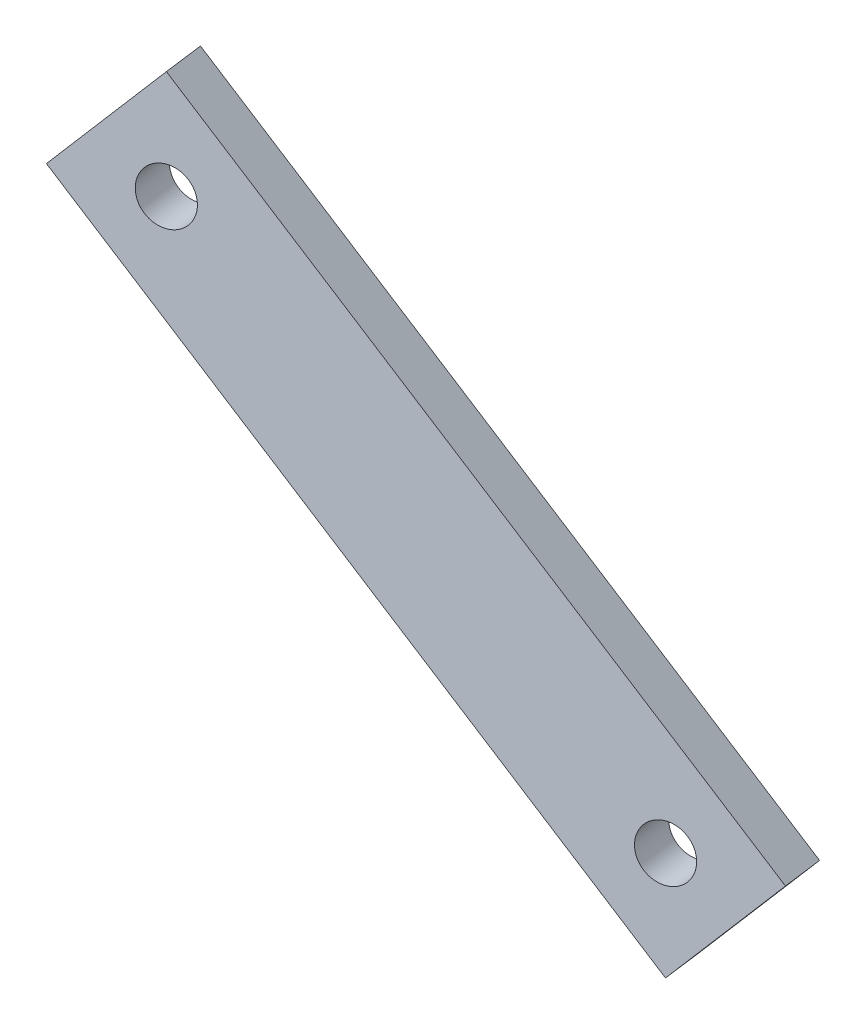
ISO-10303-21;
HEADER;
FILE_DESCRIPTION(('STEP AP214'),'2;1');
FILE_NAME('part.step','',(''),(''),'','','');
FILE_SCHEMA(('AUTOMOTIVE_DESIGN { 1 0 10303 214 1 1 1 1 }'));
ENDSEC;
DATA;
#1=APPLICATION_CONTEXT('core data for automotive mechanical design processes');
#2=APPLICATION_PROTOCOL_DEFINITION('international standard','automotive_design',2000,#1);
#3=PRODUCT_CONTEXT('',#1,'mechanical');
#4=PRODUCT('Part','Part','',(#3));
#5=PRODUCT_RELATED_PRODUCT_CATEGORY('part','',(#4));
#6=PRODUCT_DEFINITION_FORMATION('','',#4);
#7=PRODUCT_DEFINITION_CONTEXT('part definition',#1,'design');
#8=PRODUCT_DEFINITION('design','',#6,#7);
#9=PRODUCT_DEFINITION_SHAPE('','',#8);
#10=(LENGTH_UNIT() NAMED_UNIT(*) SI_UNIT(.MILLI.,.METRE.));
#11=(NAMED_UNIT(*) PLANE_ANGLE_UNIT() SI_UNIT($,.RADIAN.));
#12=(NAMED_UNIT(*) SI_UNIT($,.STERADIAN.) SOLID_ANGLE_UNIT());
#13=UNCERTAINTY_MEASURE_WITH_UNIT(LENGTH_MEASURE(1.E-05),#10,'distance_accuracy_value','');
#14=(GEOMETRIC_REPRESENTATION_CONTEXT(3) GLOBAL_UNCERTAINTY_ASSIGNED_CONTEXT((#13)) GLOBAL_UNIT_ASSIGNED_CONTEXT((#10,
#11,#12)) REPRESENTATION_CONTEXT('',''));
#15=CARTESIAN_POINT('',(0.,0.,0.));
#16=DIRECTION('',(0.,0.,1.));
#17=DIRECTION('',(1.,0.,0.));
#18=AXIS2_PLACEMENT_3D('',#15,#16,#17);
#19=CARTESIAN_POINT('',(38.6285026922329,20.4555824476356,159.237957676174));
#20=DIRECTION('',(-0.233930394424774,-0.123876985558802,-0.964329333274237));
#21=DIRECTION('',(-0.97181465537802,0.,0.235746210133905));
#22=AXIS2_PLACEMENT_3D('',#19,#20,#21);
#23=PLANE('',#22);
#24=DIRECTION('',(0.755645660035762,-0.647277315176013,-0.100158443117139));
#25=VECTOR('',#24,1.);
#26=CARTESIAN_POINT('',(-16.5231212716797,-89.9630264987664,186.801119612432));
#27=LINE('',#26,#25);
#28=CARTESIAN_POINT('',(-39.9482141109045,-69.8973634471136,189.906041605288));
#29=VERTEX_POINT('',#28);
#30=CARTESIAN_POINT('',(-16.5231212716797,-89.9630264987664,186.801119612432));
#31=VERTEX_POINT('',#30);
#32=EDGE_CURVE('E54',#29,#31,#27,.T.);
#33=ORIENTED_EDGE('',*,*,#32,.T.);
#34=DIRECTION('',(0.611781175775585,0.752121379637243,-0.245024944157147));
#35=VECTOR('',#34,1.);
#36=CARTESIAN_POINT('',(-12.8524342170262,-85.4502982209429,185.330969947489));
#37=LINE('',#36,#35);
#38=CARTESIAN_POINT('',(-12.8524342170262,-85.4502982209429,185.330969947489));
#39=VERTEX_POINT('',#38);
#40=EDGE_CURVE('E85',#31,#39,#37,.T.);
#41=ORIENTED_EDGE('',*,*,#40,.T.);
#42=DIRECTION('',(-0.755645660035763,0.647277315176013,0.100158443117137));
#43=VECTOR('',#42,1.);
#44=CARTESIAN_POINT('',(-25.4341138726848,-74.6729772375418,186.998631806422));
#45=LINE('',#44,#43);
#46=CARTESIAN_POINT('',(-36.277527056251,-65.3846351692901,188.435891940345));
#47=VERTEX_POINT('',#46);
#48=EDGE_CURVE('E89',#39,#47,#45,.T.);
#49=ORIENTED_EDGE('',*,*,#48,.T.);
#50=DIRECTION('',(-0.611781175775583,-0.752121379637243,0.245024944157152));
#51=VECTOR('',#50,1.);
#52=CARTESIAN_POINT('',(-39.9482141109045,-69.8973634471136,189.906041605288));
#53=LINE('',#52,#51);
#54=EDGE_CURVE('E96',#47,#29,#53,.T.);
#55=ORIENTED_EDGE('',*,*,#54,.T.);
#56=EDGE_LOOP('',(#33,#41,#49,#55));
#57=FACE_BOUND('',#56,.T.);
#58=CARTESIAN_POINT('',(-16.954585245294,-85.7646712331469,186.366468251513));
#59=DIRECTION('',(0.233930394424774,0.123876985558802,0.964329333274237));
#60=DIRECTION('',(0.971814655378021,0.,-0.235746210133904));
#61=AXIS2_PLACEMENT_3D('',#58,#59,#60);
#62=CIRCLE('',#61,1.10000033999937);
#63=CARTESIAN_POINT('',(-15.8855887939618,-85.7646712331469,186.107147340212));
#64=VERTEX_POINT('',#63);
#65=EDGE_CURVE('E103',#64,#64,#62,.T.);
#66=ORIENTED_EDGE('',*,*,#65,.F.);
#67=EDGE_LOOP('',(#66));
#68=FACE_BOUND('',#67,.T.);
#69=CARTESIAN_POINT('',(-35.8458041243041,-69.5826720725501,188.870439585666));
#70=DIRECTION('',(0.233930394424774,0.123876985558802,0.964329333274237));
#71=DIRECTION('',(0.971814655378021,0.,-0.235746210133904));
#72=AXIS2_PLACEMENT_3D('',#69,#70,#71);
#73=CIRCLE('',#72,1.1000003399993);
#74=CARTESIAN_POINT('',(-34.776807672972,-69.5826720725501,188.611118674365));
#75=VERTEX_POINT('',#74);
#76=EDGE_CURVE('E141',#75,#75,#73,.T.);
#77=ORIENTED_EDGE('',*,*,#76,.F.);
#78=EDGE_LOOP('',(#77));
#79=FACE_BOUND('',#78,.T.);
#80=ADVANCED_FACE('F37',(#57,#68,#79),#23,.F.);
#81=CARTESIAN_POINT('',(38.1606419033834,20.207828476518,157.309299009626));
#82=DIRECTION('',(-0.233930394424774,-0.123876985558802,-0.964329333274237));
#83=DIRECTION('',(-0.97181465537802,0.,0.235746210133905));
#84=AXIS2_PLACEMENT_3D('',#81,#82,#83);
#85=PLANE('',#84);
#86=CARTESIAN_POINT('',(-17.4224460341436,-86.0124252042645,184.437809584964));
#87=DIRECTION('',(0.233930394424774,0.123876985558802,0.964329333274237));
#88=DIRECTION('',(0.971814655378021,0.,-0.235746210133904));
#89=AXIS2_PLACEMENT_3D('',#86,#87,#88);
#90=CIRCLE('',#89,1.10000033999937);
#91=CARTESIAN_POINT('',(-16.3534495828114,-86.0124252042645,184.178488673664));
#92=VERTEX_POINT('',#91);
#93=EDGE_CURVE('E146',#92,#92,#90,.T.);
#94=ORIENTED_EDGE('',*,*,#93,.T.);
#95=EDGE_LOOP('',(#94));
#96=FACE_BOUND('',#95,.T.);
#97=DIRECTION('',(0.611781175775585,0.752121379637243,-0.245024944157147));
#98=VECTOR('',#97,1.);
#99=CARTESIAN_POINT('',(-13.3202950058757,-85.6980521920605,183.402311280941));
#100=LINE('',#99,#98);
#101=CARTESIAN_POINT('',(-16.9909820605293,-90.210780469884,184.872460945884));
#102=VERTEX_POINT('',#101);
#103=CARTESIAN_POINT('',(-13.3202950058757,-85.6980521920605,183.402311280941));
#104=VERTEX_POINT('',#103);
#105=EDGE_CURVE('E92',#102,#104,#100,.T.);
#106=ORIENTED_EDGE('',*,*,#105,.F.);
#107=DIRECTION('',(0.755645660035781,-0.64727731517599,-0.100158443117145));
#108=VECTOR('',#107,1.);
#109=CARTESIAN_POINT('',(-29.5726617161879,-79.4334594864829,186.540122804816));
#110=LINE('',#109,#108);
#111=CARTESIAN_POINT('',(-40.416074899754,-70.1451174182312,187.97738293874));
#112=VERTEX_POINT('',#111);
#113=EDGE_CURVE('E78',#112,#102,#110,.T.);
#114=ORIENTED_EDGE('',*,*,#113,.F.);
#115=DIRECTION('',(-0.611781175775583,-0.752121379637243,0.245024944157152));
#116=VECTOR('',#115,1.);
#117=CARTESIAN_POINT('',(-40.416074899754,-70.1451174182312,187.97738293874));
#118=LINE('',#117,#116);
#119=CARTESIAN_POINT('',(-36.7453878451006,-65.6323891404078,186.507233273797));
#120=VERTEX_POINT('',#119);
#121=EDGE_CURVE('E105',#120,#112,#118,.T.);
#122=ORIENTED_EDGE('',*,*,#121,.F.);
#123=DIRECTION('',(-0.755645660035931,0.647277315175804,0.100158443117217));
#124=VECTOR('',#123,1.);
#125=CARTESIAN_POINT('',(-36.7453878451006,-65.6323891404078,186.507233273797));
#126=LINE('',#125,#124);
#127=EDGE_CURVE('E71',#104,#120,#126,.T.);
#128=ORIENTED_EDGE('',*,*,#127,.F.);
#129=EDGE_LOOP('',(#106,#114,#122,#128));
#130=FACE_BOUND('',#129,.T.);
#131=CARTESIAN_POINT('',(-36.3136649131537,-69.8304260436677,186.941780919118));
#132=DIRECTION('',(0.233930394424774,0.123876985558802,0.964329333274237));
#133=DIRECTION('',(0.971814655378021,0.,-0.235746210133904));
#134=AXIS2_PLACEMENT_3D('',#131,#132,#133);
#135=CIRCLE('',#134,1.1000003399993);
#136=CARTESIAN_POINT('',(-35.2446684618216,-69.8304260436677,186.682460007817));
#137=VERTEX_POINT('',#136);
#138=EDGE_CURVE('E144',#137,#137,#135,.T.);
#139=ORIENTED_EDGE('',*,*,#138,.T.);
#140=EDGE_LOOP('',(#139));
#141=FACE_BOUND('',#140,.T.);
#142=ADVANCED_FACE('F112',(#96,#130,#141),#85,.T.);
#143=CARTESIAN_POINT('',(-12.8524342170262,-85.4502982209429,185.330969947489));
#144=DIRECTION('',(-0.755645660035782,0.647277315175989,0.100158443117146));
#145=DIRECTION('',(-0.650548598653905,-0.759464627740779,0.));
#146=AXIS2_PLACEMENT_3D('',#143,#144,#145);
#147=PLANE('',#146);
#148=ORIENTED_EDGE('',*,*,#105,.T.);
#149=DIRECTION('',(-0.233930394424774,-0.123876985558802,-0.964329333274237));
#150=VECTOR('',#149,1.);
#151=CARTESIAN_POINT('',(-12.8524342170262,-85.4502982209429,185.330969947489));
#152=LINE('',#151,#150);
#153=EDGE_CURVE('E46',#39,#104,#152,.T.);
#154=ORIENTED_EDGE('',*,*,#153,.F.);
#155=ORIENTED_EDGE('',*,*,#40,.F.);
#156=DIRECTION('',(-0.233930394424774,-0.123876985558802,-0.964329333274237));
#157=VECTOR('',#156,1.);
#158=CARTESIAN_POINT('',(-16.5231212716797,-89.9630264987664,186.801119612432));
#159=LINE('',#158,#157);
#160=EDGE_CURVE('E11',#31,#102,#159,.T.);
#161=ORIENTED_EDGE('',*,*,#160,.T.);
#162=EDGE_LOOP('',(#148,#154,#155,#161));
#163=FACE_BOUND('',#162,.T.);
#164=ADVANCED_FACE('F39',(#163),#147,.F.);
#165=CARTESIAN_POINT('',(-36.277527056251,-65.3846351692901,188.435891940345));
#166=DIRECTION('',(-0.611781175775398,-0.752121379637402,0.245024944157127));
#167=DIRECTION('',(0.77576933080262,-0.631016596759589,0.));
#168=AXIS2_PLACEMENT_3D('',#165,#166,#167);
#169=PLANE('',#168);
#170=ORIENTED_EDGE('',*,*,#127,.T.);
#171=DIRECTION('',(-0.233930394424774,-0.123876985558802,-0.964329333274237));
#172=VECTOR('',#171,1.);
#173=CARTESIAN_POINT('',(-36.277527056251,-65.3846351692901,188.435891940345));
#174=LINE('',#173,#172);
#175=EDGE_CURVE('E93',#47,#120,#174,.T.);
#176=ORIENTED_EDGE('',*,*,#175,.F.);
#177=ORIENTED_EDGE('',*,*,#48,.F.);
#178=ORIENTED_EDGE('',*,*,#153,.T.);
#179=EDGE_LOOP('',(#170,#176,#177,#178));
#180=FACE_BOUND('',#179,.T.);
#181=ADVANCED_FACE('F94',(#180),#169,.F.);
#182=CARTESIAN_POINT('',(-39.9482141109045,-69.8973634471136,189.906041605288));
#183=DIRECTION('',(0.755645660035783,-0.647277315175988,-0.100158443117146));
#184=DIRECTION('',(0.650548598653904,0.75946462774078,0.));
#185=AXIS2_PLACEMENT_3D('',#182,#183,#184);
#186=PLANE('',#185);
#187=ORIENTED_EDGE('',*,*,#121,.T.);
#188=DIRECTION('',(-0.233930394424774,-0.123876985558802,-0.964329333274237));
#189=VECTOR('',#188,1.);
#190=CARTESIAN_POINT('',(-39.9482141109045,-69.8973634471136,189.906041605288));
#191=LINE('',#190,#189);
#192=EDGE_CURVE('E98',#29,#112,#191,.T.);
#193=ORIENTED_EDGE('',*,*,#192,.F.);
#194=ORIENTED_EDGE('',*,*,#54,.F.);
#195=ORIENTED_EDGE('',*,*,#175,.T.);
#196=EDGE_LOOP('',(#187,#193,#194,#195));
#197=FACE_BOUND('',#196,.T.);
#198=ADVANCED_FACE('F110',(#197),#186,.F.);
#199=CARTESIAN_POINT('',(-29.1048009273383,-79.1857055153653,188.468781471365));
#200=DIRECTION('',(0.611781175775586,0.752121379637241,-0.245024944157152));
#201=DIRECTION('',(-0.775769330802459,0.631016596759788,0.));
#202=AXIS2_PLACEMENT_3D('',#199,#200,#201);
#203=PLANE('',#202);
#204=ORIENTED_EDGE('',*,*,#113,.T.);
#205=ORIENTED_EDGE('',*,*,#160,.F.);
#206=ORIENTED_EDGE('',*,*,#32,.F.);
#207=ORIENTED_EDGE('',*,*,#192,.T.);
#208=EDGE_LOOP('',(#204,#205,#206,#207));
#209=FACE_BOUND('',#208,.T.);
#210=ADVANCED_FACE('F114',(#209),#203,.F.);
#211=CARTESIAN_POINT('',(-16.954585245294,-85.7646712331469,186.366468251513));
#212=DIRECTION('',(-0.233930394424774,-0.123876985558802,-0.964329333274237));
#213=DIRECTION('',(-0.971814655378021,0.,0.235746210133904));
#214=AXIS2_PLACEMENT_3D('',#211,#212,#213);
#215=CYLINDRICAL_SURFACE('',#214,1.10000033999937);
#216=ORIENTED_EDGE('',*,*,#65,.T.);
#217=EDGE_LOOP('',(#216));
#218=FACE_BOUND('',#217,.T.);
#219=ORIENTED_EDGE('',*,*,#93,.F.);
#220=EDGE_LOOP('',(#219));
#221=FACE_BOUND('',#220,.T.);
#222=ADVANCED_FACE('F116',(#218,#221),#215,.F.);
#223=CARTESIAN_POINT('',(-35.8458041243041,-69.5826720725501,188.870439585666));
#224=DIRECTION('',(-0.233930394424774,-0.123876985558802,-0.964329333274237));
#225=DIRECTION('',(-0.971814655378021,0.,0.235746210133904));
#226=AXIS2_PLACEMENT_3D('',#223,#224,#225);
#227=CYLINDRICAL_SURFACE('',#226,1.1000003399993);
#228=ORIENTED_EDGE('',*,*,#76,.T.);
#229=EDGE_LOOP('',(#228));
#230=FACE_BOUND('',#229,.T.);
#231=ORIENTED_EDGE('',*,*,#138,.F.);
#232=EDGE_LOOP('',(#231));
#233=FACE_BOUND('',#232,.T.);
#234=ADVANCED_FACE('F122',(#230,#233),#227,.F.);
#235=CLOSED_SHELL('',(#80,#142,#164,#181,#198,#210,#222,#234));
#236=MANIFOLD_SOLID_BREP('B2',#235);
#237=ADVANCED_BREP_SHAPE_REPRESENTATION('',(#18,#236),#14);
#238=SHAPE_DEFINITION_REPRESENTATION(#9,#237);
ENDSEC;
END-ISO-10303-21;
